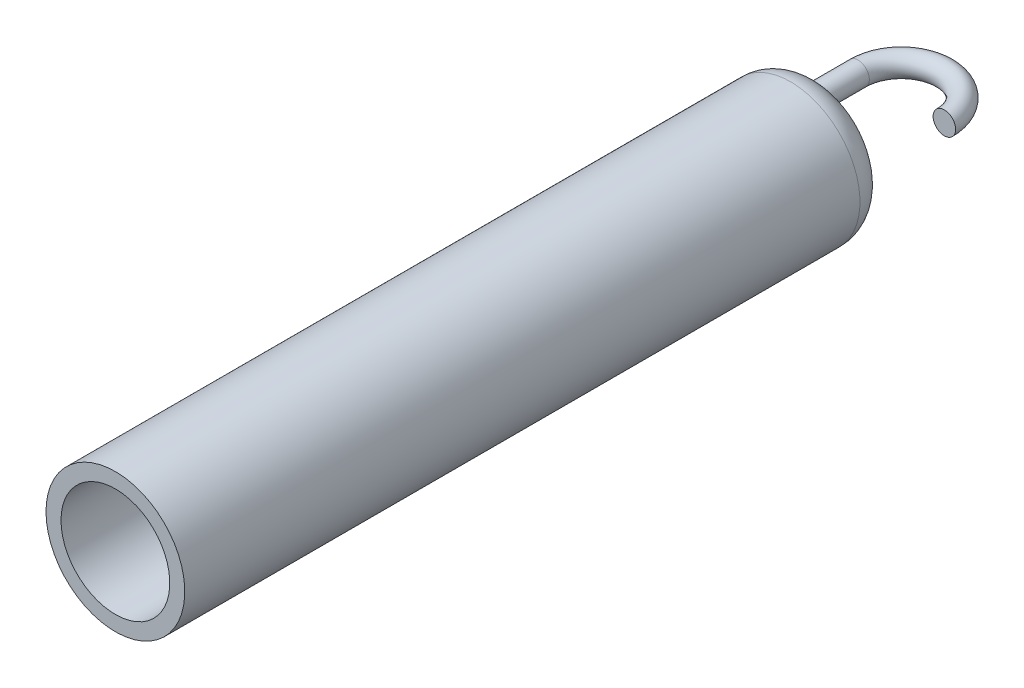
ISO-10303-21;
HEADER;
FILE_DESCRIPTION(('STEP AP214'),'2;1');
FILE_NAME('part.step','',(''),(''),'','','');
FILE_SCHEMA(('AUTOMOTIVE_DESIGN { 1 0 10303 214 1 1 1 1 }'));
ENDSEC;
DATA;
#1=APPLICATION_CONTEXT('core data for automotive mechanical design processes');
#2=APPLICATION_PROTOCOL_DEFINITION('international standard','automotive_design',2000,#1);
#3=PRODUCT_CONTEXT('',#1,'mechanical');
#4=PRODUCT('Part','Part','',(#3));
#5=PRODUCT_RELATED_PRODUCT_CATEGORY('part','',(#4));
#6=PRODUCT_DEFINITION_FORMATION('','',#4);
#7=PRODUCT_DEFINITION_CONTEXT('part definition',#1,'design');
#8=PRODUCT_DEFINITION('design','',#6,#7);
#9=PRODUCT_DEFINITION_SHAPE('','',#8);
#10=(LENGTH_UNIT() NAMED_UNIT(*) SI_UNIT(.MILLI.,.METRE.));
#11=(NAMED_UNIT(*) PLANE_ANGLE_UNIT() SI_UNIT($,.RADIAN.));
#12=(NAMED_UNIT(*) SI_UNIT($,.STERADIAN.) SOLID_ANGLE_UNIT());
#13=UNCERTAINTY_MEASURE_WITH_UNIT(LENGTH_MEASURE(1.E-05),#10,'distance_accuracy_value','');
#14=(GEOMETRIC_REPRESENTATION_CONTEXT(3) GLOBAL_UNCERTAINTY_ASSIGNED_CONTEXT((#13)) GLOBAL_UNIT_ASSIGNED_CONTEXT((#10,
#11,#12)) REPRESENTATION_CONTEXT('',''));
#15=CARTESIAN_POINT('',(0.,0.,0.));
#16=DIRECTION('',(0.,0.,1.));
#17=DIRECTION('',(1.,0.,0.));
#18=AXIS2_PLACEMENT_3D('',#15,#16,#17);
#19=CARTESIAN_POINT('',(0.,0.,-44.9999999999999));
#20=DIRECTION('',(0.,0.,-1.));
#21=DIRECTION('',(-1.,0.,0.));
#22=AXIS2_PLACEMENT_3D('',#19,#20,#21);
#23=TOROIDAL_SURFACE('',#22,5.24999999999994,4.00000000000006);
#24=CARTESIAN_POINT('',(0.,0.,-44.9999999999999));
#25=DIRECTION('',(0.,0.,-1.));
#26=DIRECTION('',(-1.,0.,0.));
#27=AXIS2_PLACEMENT_3D('',#24,#25,#26);
#28=CIRCLE('',#27,9.25);
#29=CARTESIAN_POINT('',(-9.25,0.,-44.9999999999999));
#30=VERTEX_POINT('',#29);
#31=EDGE_CURVE('E63',#30,#30,#28,.T.);
#32=ORIENTED_EDGE('',*,*,#31,.T.);
#33=EDGE_LOOP('',(#32));
#34=FACE_BOUND('',#33,.T.);
#35=CARTESIAN_POINT('',(0.,0.,-49.));
#36=DIRECTION('',(0.,0.,-1.));
#37=DIRECTION('',(-1.,0.,0.));
#38=AXIS2_PLACEMENT_3D('',#35,#36,#37);
#39=CIRCLE('',#38,5.24999999999994);
#40=CARTESIAN_POINT('',(-5.07608695652169,1.3400900006454,-49.));
#41=VERTEX_POINT('',#40);
#42=CARTESIAN_POINT('',(-5.07608695652169,-1.3400900006454,-49.));
#43=VERTEX_POINT('',#42);
#44=EDGE_CURVE('E61',#41,#43,#39,.T.);
#45=ORIENTED_EDGE('',*,*,#44,.F.);
#46=CARTESIAN_POINT('',(-7.00648582720763,-0.819294431829194,-48.5699822132683));
#47=CARTESIAN_POINT('',(-6.95880276354394,-0.89241963811899,-48.5896247700951));
#48=CARTESIAN_POINT('',(-6.90495205526455,-0.961029564039703,-48.6111751680601));
#49=CARTESIAN_POINT('',(-6.78664381902749,-1.0876059666946,-48.6563949104901));
#50=CARTESIAN_POINT('',(-6.722178803184,-1.14556486811943,-48.6800657454082));
#51=CARTESIAN_POINT('',(-6.5844565255144,-1.24944427687394,-48.7278267954799));
#52=CARTESIAN_POINT('',(-6.51121003605053,-1.29537931813734,-48.7519164664298));
#53=CARTESIAN_POINT('',(-6.35763599431734,-1.37412635623365,-48.7989480205856));
#54=CARTESIAN_POINT('',(-6.27730933604538,-1.40694000698701,-48.82189004813));
#55=CARTESIAN_POINT('',(-6.11075746420721,-1.45860321330962,-48.8653086789364));
#56=CARTESIAN_POINT('',(-6.02448466271204,-1.47732112595096,-48.8857605799956));
#57=CARTESIAN_POINT('',(-5.84911659656696,-1.49932499102619,-48.9224922740108));
#58=CARTESIAN_POINT('',(-5.76002240718185,-1.50261675295842,-48.9387736354104));
#59=CARTESIAN_POINT('',(-5.58686734326178,-1.49347777049111,-48.9652049402742));
#60=CARTESIAN_POINT('',(-5.50280560017314,-1.48192209509465,-48.9756485668979));
#61=CARTESIAN_POINT('',(-5.33738797020383,-1.44462117010289,-48.9911322484317));
#62=CARTESIAN_POINT('',(-5.25603084049764,-1.41888253617484,-48.9961748194484));
#63=CARTESIAN_POINT('',(-5.10353815170019,-1.3559045242371,-49.0006693060912));
#64=CARTESIAN_POINT('',(-5.03208185257051,-1.31946028511138,-49.0004427471582));
#65=CARTESIAN_POINT('',(-4.89599422909807,-1.2357413106536,-48.9957005906926));
#66=CARTESIAN_POINT('',(-4.831362947117,-1.1884665081039,-48.9911849665403));
#67=CARTESIAN_POINT('',(-4.71045148341299,-1.08430918240141,-48.9788956140234));
#68=CARTESIAN_POINT('',(-4.65419430619093,-1.02740107876556,-48.9711131271348));
#69=CARTESIAN_POINT('',(-4.5515127497806,-0.905529310858771,-48.9537934234672));
#70=CARTESIAN_POINT('',(-4.50509274037591,-0.840562086863528,-48.9442554303725));
#71=CARTESIAN_POINT('',(-4.42095130481305,-0.70046623711611,-48.9247285433275));
#72=CARTESIAN_POINT('',(-4.38381970514963,-0.624981933913588,-48.9147424784738));
#73=CARTESIAN_POINT('',(-4.32261954007652,-0.468644287017166,-48.8970357515464));
#74=CARTESIAN_POINT('',(-4.29854767844395,-0.387792303890754,-48.8893145180649));
#75=CARTESIAN_POINT('',(-4.26428925533951,-0.223004838363475,-48.8780028280472));
#76=CARTESIAN_POINT('',(-4.25408386171937,-0.139073697311763,-48.8744067701172));
#77=CARTESIAN_POINT('',(-4.24792302195601,0.0293591736732388,-48.8722603631427));
#78=CARTESIAN_POINT('',(-4.2519631525244,0.113860718361565,-48.8737084478712));
#79=CARTESIAN_POINT('',(-4.27354825757059,0.276568191186246,-48.8810706777133));
#80=CARTESIAN_POINT('',(-4.2904066769259,0.354877457814284,-48.8867574976105));
#81=CARTESIAN_POINT('',(-4.33624370790428,0.50759688525563,-48.9010435934114));
#82=CARTESIAN_POINT('',(-4.36522737904318,0.58200540379775,-48.9096440848204));
#83=CARTESIAN_POINT('',(-4.4357317619785,0.727645680276282,-48.9282877684499));
#84=CARTESIAN_POINT('',(-4.47764937109523,0.798680167553703,-48.938370405743));
#85=CARTESIAN_POINT('',(-4.57261209771403,0.9330187464743,-48.9576634550197));
#86=CARTESIAN_POINT('',(-4.62565777874425,0.996322446371653,-48.9668738227969));
#87=CARTESIAN_POINT('',(-4.74336325147982,1.11529644327687,-48.9827959987862));
#88=CARTESIAN_POINT('',(-4.80832104227681,1.17068438911552,-48.9894255289928));
#89=CARTESIAN_POINT('',(-4.94688923901598,1.26974771242417,-48.9982348480398));
#90=CARTESIAN_POINT('',(-5.02049641058066,1.31342744817873,-49.000416294646));
#91=CARTESIAN_POINT('',(-5.17038147945679,1.38587162152664,-48.9994727829872));
#92=CARTESIAN_POINT('',(-5.24636670109369,1.41524569365243,-48.9965948198497));
#93=CARTESIAN_POINT('',(-5.40175300013476,1.46126259884585,-48.9858421030453));
#94=CARTESIAN_POINT('',(-5.48115382189077,1.47790638299492,-48.9779677227418));
#95=CARTESIAN_POINT('',(-5.63918322973002,1.49797317890163,-48.957811772954));
#96=CARTESIAN_POINT('',(-5.71778886113814,1.50168582491517,-48.9456335779824));
#97=CARTESIAN_POINT('',(-5.87394183749304,1.49691142715464,-48.9175337391294));
#98=CARTESIAN_POINT('',(-5.95148899954726,1.48842230131811,-48.9016114567595));
#99=CARTESIAN_POINT('',(-6.10719710869636,1.45909909412225,-48.8661287325446));
#100=CARTESIAN_POINT('',(-6.18522450734554,1.4377192180346,-48.8464354011926));
#101=CARTESIAN_POINT('',(-6.33640377085763,1.38296787287246,-48.8050948133783));
#102=CARTESIAN_POINT('',(-6.40955392722006,1.34959222756651,-48.7834468784042));
#103=CARTESIAN_POINT('',(-6.5541227989901,1.26912478063694,-48.7379570918976));
#104=CARTESIAN_POINT('',(-6.6251000216024,1.22126613767108,-48.7140652498));
#105=CARTESIAN_POINT('',(-6.75807165028333,1.11404207662126,-48.6670145971367));
#106=CARTESIAN_POINT('',(-6.82006335003475,1.05467320434612,-48.6438560090518));
#107=CARTESIAN_POINT('',(-6.93461412611736,0.924324720502867,-48.5994196806079));
#108=CARTESIAN_POINT('',(-6.98694046083527,0.853121960762416,-48.5781933890605));
#109=CARTESIAN_POINT('',(-7.07864920398065,0.701789509307921,-48.5399662401913));
#110=CARTESIAN_POINT('',(-7.11803726785092,0.621663738491103,-48.5229635374926));
#111=CARTESIAN_POINT('',(-7.18036757850432,0.459519008752517,-48.4956096638021));
#112=CARTESIAN_POINT('',(-7.20411680440399,0.377866025477641,-48.4849355673988));
#113=CARTESIAN_POINT('',(-7.23748658830593,0.211175139604464,-48.4698439483644));
#114=CARTESIAN_POINT('',(-7.24711599085114,0.126139390264639,-48.4654225091813));
#115=CARTESIAN_POINT('',(-7.25158223795804,-0.0375110020045436,-48.4633767679949));
#116=CARTESIAN_POINT('',(-7.24754873555806,-0.116090802379801,-48.4652333726547));
#117=CARTESIAN_POINT('',(-7.22733122929713,-0.271322666102538,-48.4744420141106));
#118=CARTESIAN_POINT('',(-7.21114949543935,-0.34797508683255,-48.4817930242279));
#119=CARTESIAN_POINT('',(-7.1684867048646,-0.493280985551058,-48.5008315726189));
#120=CARTESIAN_POINT('',(-7.14259692324266,-0.562143091311063,-48.5122686444378));
#121=CARTESIAN_POINT('',(-7.0813851527296,-0.69480625262899,-48.5386922862724));
#122=CARTESIAN_POINT('',(-7.04605959422051,-0.758605380955884,-48.5536801993522));
#123=CARTESIAN_POINT('',(-7.00648582720763,-0.819294431829194,-48.5699822132683));
#124=B_SPLINE_CURVE_WITH_KNOTS('',3,(#46,#47,#48,#49,#50,#51,#52,#53,#54,#55,#56,#57,#58,#59,
#60,#61,#62,#63,#64,#65,#66,#67,#68,#69,#70,#71,#72,#73,#74,#75,#76,#77,#78,#79,#80,#81,#82,#83,
#84,#85,#86,#87,#88,#89,#90,#91,#92,#93,#94,#95,#96,#97,#98,#99,#100,#101,#102,#103,#104,#105,
#106,#107,#108,#109,#110,#111,#112,#113,#114,#115,#116,#117,#118,#119,#120,#121,#122,#123),
.UNSPECIFIED.,.T.,.F.,(4,2,2,2,2,2,2,2,2,2,2,2,2,2,2,2,2,2,2,2,2,2,2,2,2,2,2,2,2,2,2,2,2,2,2,2,
2,2,4),(0.,0.268158578395402,0.536507146777401,0.804529833023027,1.0725187249817,
1.34298039732285,1.61334020543339,1.86847301937179,2.12348692675305,2.36298296622263,
2.6024804921148,2.84262425853478,3.08287447701335,3.33582985796499,3.58872136430689,
3.84126907245453,4.09373837050332,4.33356219345329,4.57348618789935,4.8216617754388,
5.06984993368279,5.32540491323163,5.58086463202426,5.82419688833831,6.06751096349197,
6.30533890634551,6.54320743604406,6.79193339334122,7.0407460266076,7.30616677368506,
7.57166729650593,7.84290425505269,8.11402249505392,8.36974275780564,8.6253027709282,
8.86026601875068,9.09518537256239,9.31765485131046,9.54020861125279),.UNSPECIFIED.);
#125=EDGE_CURVE('E54',#41,#43,#124,.T.);
#126=ORIENTED_EDGE('',*,*,#125,.T.);
#127=EDGE_LOOP('',(#45,#126));
#128=FACE_BOUND('',#127,.T.);
#129=ADVANCED_FACE('F39',(#34,#128),#23,.T.);
#130=CARTESIAN_POINT('',(0.,0.,45.));
#131=DIRECTION('',(0.,0.,1.));
#132=DIRECTION('',(1.,0.,0.));
#133=AXIS2_PLACEMENT_3D('',#130,#131,#132);
#134=PLANE('',#133);
#135=CARTESIAN_POINT('',(0.,0.,45.));
#136=DIRECTION('',(0.,0.,1.));
#137=DIRECTION('',(1.,0.,0.));
#138=AXIS2_PLACEMENT_3D('',#135,#136,#137);
#139=CIRCLE('',#138,9.25);
#140=CARTESIAN_POINT('',(-9.25,0.,45.));
#141=VERTEX_POINT('',#140);
#142=EDGE_CURVE('E48',#141,#141,#139,.T.);
#143=ORIENTED_EDGE('',*,*,#142,.T.);
#144=EDGE_LOOP('',(#143));
#145=FACE_BOUND('',#144,.T.);
#146=CARTESIAN_POINT('',(0.,0.,45.));
#147=DIRECTION('',(0.,0.,1.));
#148=DIRECTION('',(1.,0.,0.));
#149=AXIS2_PLACEMENT_3D('',#146,#147,#148);
#150=CIRCLE('',#149,7.25);
#151=CARTESIAN_POINT('',(-7.25,0.,45.));
#152=VERTEX_POINT('',#151);
#153=EDGE_CURVE('E73',#152,#152,#150,.T.);
#154=ORIENTED_EDGE('',*,*,#153,.F.);
#155=EDGE_LOOP('',(#154));
#156=FACE_BOUND('',#155,.T.);
#157=ADVANCED_FACE('F84',(#145,#156),#134,.T.);
#158=CARTESIAN_POINT('',(0.,0.,45.));
#159=DIRECTION('',(0.,0.,-1.));
#160=DIRECTION('',(-1.,0.,0.));
#161=AXIS2_PLACEMENT_3D('',#158,#159,#160);
#162=CYLINDRICAL_SURFACE('',#161,9.25);
#163=CARTESIAN_POINT('',(-9.25,0.,45.));
#164=CARTESIAN_POINT('',(-9.25,0.,44.0625));
#165=CARTESIAN_POINT('',(-9.25,0.,43.125));
#166=CARTESIAN_POINT('',(-9.25,0.,41.25));
#167=CARTESIAN_POINT('',(-9.25,0.,40.3125));
#168=CARTESIAN_POINT('',(-9.25,0.,38.4375));
#169=CARTESIAN_POINT('',(-9.25,0.,37.5));
#170=CARTESIAN_POINT('',(-9.25,0.,35.625));
#171=CARTESIAN_POINT('',(-9.25,0.,34.6875));
#172=CARTESIAN_POINT('',(-9.25,0.,32.8125));
#173=CARTESIAN_POINT('',(-9.25,0.,31.875));
#174=CARTESIAN_POINT('',(-9.25,0.,30.));
#175=CARTESIAN_POINT('',(-9.25,0.,29.0625));
#176=CARTESIAN_POINT('',(-9.25,0.,27.1875));
#177=CARTESIAN_POINT('',(-9.25,0.,26.25));
#178=CARTESIAN_POINT('',(-9.25,0.,24.375));
#179=CARTESIAN_POINT('',(-9.25,0.,23.4375));
#180=CARTESIAN_POINT('',(-9.25,0.,21.5625));
#181=CARTESIAN_POINT('',(-9.25,0.,20.625));
#182=CARTESIAN_POINT('',(-9.25,0.,18.75));
#183=CARTESIAN_POINT('',(-9.25,0.,17.8125));
#184=CARTESIAN_POINT('',(-9.25,0.,15.9375));
#185=CARTESIAN_POINT('',(-9.25,0.,15.));
#186=CARTESIAN_POINT('',(-9.25,0.,13.125));
#187=CARTESIAN_POINT('',(-9.25,0.,12.1875));
#188=CARTESIAN_POINT('',(-9.25,0.,10.3125));
#189=CARTESIAN_POINT('',(-9.25,0.,9.37500000000002));
#190=CARTESIAN_POINT('',(-9.25,0.,7.50000000000002));
#191=CARTESIAN_POINT('',(-9.25,0.,6.56250000000002));
#192=CARTESIAN_POINT('',(-9.25,0.,4.68750000000002));
#193=CARTESIAN_POINT('',(-9.25,0.,3.75000000000002));
#194=CARTESIAN_POINT('',(-9.25,0.,1.87500000000002));
#195=CARTESIAN_POINT('',(-9.25,0.,0.937500000000026));
#196=CARTESIAN_POINT('',(-9.25,0.,-0.937499999999971));
#197=CARTESIAN_POINT('',(-9.25,0.,-1.87499999999997));
#198=CARTESIAN_POINT('',(-9.25,0.,-3.74999999999997));
#199=CARTESIAN_POINT('',(-9.25,0.,-4.68749999999997));
#200=CARTESIAN_POINT('',(-9.25,0.,-6.56249999999997));
#201=CARTESIAN_POINT('',(-9.25,0.,-7.49999999999997));
#202=CARTESIAN_POINT('',(-9.25,0.,-9.37499999999997));
#203=CARTESIAN_POINT('',(-9.25,0.,-10.3125));
#204=CARTESIAN_POINT('',(-9.25,0.,-12.1875));
#205=CARTESIAN_POINT('',(-9.25,0.,-13.125));
#206=CARTESIAN_POINT('',(-9.25,0.,-15.));
#207=CARTESIAN_POINT('',(-9.25,0.,-15.9375));
#208=CARTESIAN_POINT('',(-9.25,0.,-17.8125));
#209=CARTESIAN_POINT('',(-9.25,0.,-18.7499999999999));
#210=CARTESIAN_POINT('',(-9.25,0.,-20.6249999999999));
#211=CARTESIAN_POINT('',(-9.25,0.,-21.5624999999999));
#212=CARTESIAN_POINT('',(-9.25,0.,-23.4374999999999));
#213=CARTESIAN_POINT('',(-9.25,0.,-24.3749999999999));
#214=CARTESIAN_POINT('',(-9.25,0.,-26.2499999999999));
#215=CARTESIAN_POINT('',(-9.25,0.,-27.1874999999999));
#216=CARTESIAN_POINT('',(-9.25,0.,-29.0624999999999));
#217=CARTESIAN_POINT('',(-9.25,0.,-29.9999999999999));
#218=CARTESIAN_POINT('',(-9.25,0.,-31.8749999999999));
#219=CARTESIAN_POINT('',(-9.25,0.,-32.8124999999999));
#220=CARTESIAN_POINT('',(-9.25,0.,-34.6874999999999));
#221=CARTESIAN_POINT('',(-9.25,0.,-35.6249999999999));
#222=CARTESIAN_POINT('',(-9.25,0.,-37.4999999999999));
#223=CARTESIAN_POINT('',(-9.25,0.,-38.4374999999999));
#224=CARTESIAN_POINT('',(-9.25,0.,-40.3124999999999));
#225=CARTESIAN_POINT('',(-9.25,0.,-41.2499999999999));
#226=CARTESIAN_POINT('',(-9.25,0.,-43.1249999999999));
#227=CARTESIAN_POINT('',(-9.25,0.,-44.0624999999999));
#228=CARTESIAN_POINT('',(-9.25,0.,-44.9999999999999));
#229=B_SPLINE_CURVE_WITH_KNOTS('',3,(#163,#164,#165,#166,#167,#168,#169,#170,#171,#172,#173,
#174,#175,#176,#177,#178,#179,#180,#181,#182,#183,#184,#185,#186,#187,#188,#189,#190,#191,#192,
#193,#194,#195,#196,#197,#198,#199,#200,#201,#202,#203,#204,#205,#206,#207,#208,#209,#210,#211,
#212,#213,#214,#215,#216,#217,#218,#219,#220,#221,#222,#223,#224,#225,#226,#227,#228),
.UNSPECIFIED.,.F.,.F.,(4,2,2,2,2,2,2,2,2,2,2,2,2,2,2,2,2,2,2,2,2,2,2,2,2,2,2,2,2,2,2,2,4),(0.,
2.8125,5.62499999999999,8.43749999999999,11.25,14.0625,16.875,19.6875,22.5,25.3125,28.125,
30.9375,33.75,36.5625,39.375,42.1875,45.,47.8125,50.625,53.4375,56.25,59.0625,61.875,
64.6874999999999,67.4999999999999,70.3124999999999,73.1249999999999,75.9374999999999,
78.7499999999999,81.5624999999999,84.3749999999999,87.1874999999999,89.9999999999999),.UNSPECIFIED.);
#230=EDGE_CURVE('BSEAM41',#141,#30,#229,.T.);
#231=ORIENTED_EDGE('',*,*,#142,.F.);
#232=ORIENTED_EDGE('',*,*,#31,.F.);
#233=ORIENTED_EDGE('',*,*,#230,.T.);
#234=ORIENTED_EDGE('',*,*,#230,.F.);
#235=EDGE_LOOP('',(#231,#233,#232,#234));
#236=FACE_BOUND('',#235,.T.);
#237=ADVANCED_FACE('F41',(#236),#162,.T.);
#238=CARTESIAN_POINT('',(0.,0.,45.));
#239=DIRECTION('',(0.,0.,-1.));
#240=DIRECTION('',(-1.,0.,0.));
#241=AXIS2_PLACEMENT_3D('',#238,#239,#240);
#242=CYLINDRICAL_SURFACE('',#241,7.25);
#243=CARTESIAN_POINT('',(0.,0.,-45.));
#244=DIRECTION('',(0.,0.,1.));
#245=DIRECTION('',(1.,0.,0.));
#246=AXIS2_PLACEMENT_3D('',#243,#244,#245);
#247=CIRCLE('',#246,7.25);
#248=CARTESIAN_POINT('',(-7.25,0.,-45.));
#249=VERTEX_POINT('',#248);
#250=EDGE_CURVE('E68',#249,#249,#247,.T.);
#251=CARTESIAN_POINT('',(-7.25,0.,45.));
#252=CARTESIAN_POINT('',(-7.25,0.,44.0625));
#253=CARTESIAN_POINT('',(-7.25,0.,43.125));
#254=CARTESIAN_POINT('',(-7.25,0.,41.25));
#255=CARTESIAN_POINT('',(-7.25,0.,40.3125));
#256=CARTESIAN_POINT('',(-7.25,0.,38.4375));
#257=CARTESIAN_POINT('',(-7.25,0.,37.5));
#258=CARTESIAN_POINT('',(-7.25,0.,35.625));
#259=CARTESIAN_POINT('',(-7.25,0.,34.6875));
#260=CARTESIAN_POINT('',(-7.25,0.,32.8125));
#261=CARTESIAN_POINT('',(-7.25,0.,31.875));
#262=CARTESIAN_POINT('',(-7.25,0.,30.));
#263=CARTESIAN_POINT('',(-7.25,0.,29.0625));
#264=CARTESIAN_POINT('',(-7.25,0.,27.1875));
#265=CARTESIAN_POINT('',(-7.25,0.,26.25));
#266=CARTESIAN_POINT('',(-7.25,0.,24.375));
#267=CARTESIAN_POINT('',(-7.25,0.,23.4375));
#268=CARTESIAN_POINT('',(-7.25,0.,21.5625));
#269=CARTESIAN_POINT('',(-7.25,0.,20.625));
#270=CARTESIAN_POINT('',(-7.25,0.,18.75));
#271=CARTESIAN_POINT('',(-7.25,0.,17.8125));
#272=CARTESIAN_POINT('',(-7.25,0.,15.9375));
#273=CARTESIAN_POINT('',(-7.25,0.,15.));
#274=CARTESIAN_POINT('',(-7.25,0.,13.125));
#275=CARTESIAN_POINT('',(-7.25,0.,12.1875));
#276=CARTESIAN_POINT('',(-7.25,0.,10.3125));
#277=CARTESIAN_POINT('',(-7.25,0.,9.37499999999999));
#278=CARTESIAN_POINT('',(-7.25,0.,7.5));
#279=CARTESIAN_POINT('',(-7.25,0.,6.5625));
#280=CARTESIAN_POINT('',(-7.25,0.,4.6875));
#281=CARTESIAN_POINT('',(-7.25,0.,3.75));
#282=CARTESIAN_POINT('',(-7.25,0.,1.87499999999999));
#283=CARTESIAN_POINT('',(-7.25,0.,0.937499999999994));
#284=CARTESIAN_POINT('',(-7.25,0.,-0.937500000000008));
#285=CARTESIAN_POINT('',(-7.25,0.,-1.87500000000001));
#286=CARTESIAN_POINT('',(-7.25,0.,-3.75000000000001));
#287=CARTESIAN_POINT('',(-7.25,0.,-4.68750000000001));
#288=CARTESIAN_POINT('',(-7.25,0.,-6.56250000000001));
#289=CARTESIAN_POINT('',(-7.25,0.,-7.50000000000001));
#290=CARTESIAN_POINT('',(-7.25,0.,-9.37500000000001));
#291=CARTESIAN_POINT('',(-7.25,0.,-10.3125));
#292=CARTESIAN_POINT('',(-7.25,0.,-12.1875));
#293=CARTESIAN_POINT('',(-7.25,0.,-13.125));
#294=CARTESIAN_POINT('',(-7.25,0.,-15.));
#295=CARTESIAN_POINT('',(-7.25,0.,-15.9375));
#296=CARTESIAN_POINT('',(-7.25,0.,-17.8125));
#297=CARTESIAN_POINT('',(-7.25,0.,-18.75));
#298=CARTESIAN_POINT('',(-7.25,0.,-20.625));
#299=CARTESIAN_POINT('',(-7.25,0.,-21.5625));
#300=CARTESIAN_POINT('',(-7.25,0.,-23.4375));
#301=CARTESIAN_POINT('',(-7.25,0.,-24.375));
#302=CARTESIAN_POINT('',(-7.25,0.,-26.25));
#303=CARTESIAN_POINT('',(-7.25,0.,-27.1875));
#304=CARTESIAN_POINT('',(-7.25,0.,-29.0625));
#305=CARTESIAN_POINT('',(-7.25,0.,-30.));
#306=CARTESIAN_POINT('',(-7.25,0.,-31.875));
#307=CARTESIAN_POINT('',(-7.25,0.,-32.8125));
#308=CARTESIAN_POINT('',(-7.25,0.,-34.6875));
#309=CARTESIAN_POINT('',(-7.25,0.,-35.625));
#310=CARTESIAN_POINT('',(-7.25,0.,-37.5));
#311=CARTESIAN_POINT('',(-7.25,0.,-38.4375));
#312=CARTESIAN_POINT('',(-7.25,0.,-40.3125));
#313=CARTESIAN_POINT('',(-7.25,0.,-41.25));
#314=CARTESIAN_POINT('',(-7.25,0.,-43.125));
#315=CARTESIAN_POINT('',(-7.25,0.,-44.0625));
#316=CARTESIAN_POINT('',(-7.25,0.,-45.));
#317=B_SPLINE_CURVE_WITH_KNOTS('',3,(#251,#252,#253,#254,#255,#256,#257,#258,#259,#260,#261,
#262,#263,#264,#265,#266,#267,#268,#269,#270,#271,#272,#273,#274,#275,#276,#277,#278,#279,#280,
#281,#282,#283,#284,#285,#286,#287,#288,#289,#290,#291,#292,#293,#294,#295,#296,#297,#298,#299,
#300,#301,#302,#303,#304,#305,#306,#307,#308,#309,#310,#311,#312,#313,#314,#315,#316),
.UNSPECIFIED.,.F.,.F.,(4,2,2,2,2,2,2,2,2,2,2,2,2,2,2,2,2,2,2,2,2,2,2,2,2,2,2,2,2,2,2,2,4),(0.,
2.8125,5.62500000000001,8.4375,11.25,14.0625,16.875,19.6875,22.5,25.3125,28.125,30.9375,33.75,
36.5625,39.375,42.1875,45.,47.8125,50.625,53.4375,56.25,59.0625,61.875,64.6875,67.5,70.3125,
73.125,75.9375,78.75,81.5625,84.375,87.1875,90.),.UNSPECIFIED.);
#318=EDGE_CURVE('BSEAM89',#152,#249,#317,.T.);
#319=ORIENTED_EDGE('',*,*,#153,.T.);
#320=ORIENTED_EDGE('',*,*,#250,.F.);
#321=ORIENTED_EDGE('',*,*,#318,.T.);
#322=ORIENTED_EDGE('',*,*,#318,.F.);
#323=EDGE_LOOP('',(#319,#321,#320,#322));
#324=FACE_BOUND('',#323,.T.);
#325=ADVANCED_FACE('F89',(#324),#242,.F.);
#326=CARTESIAN_POINT('',(0.,0.,-45.));
#327=DIRECTION('',(0.,0.,1.));
#328=DIRECTION('',(1.,0.,0.));
#329=AXIS2_PLACEMENT_3D('',#326,#327,#328);
#330=PLANE('',#329);
#331=ORIENTED_EDGE('',*,*,#250,.T.);
#332=EDGE_LOOP('',(#331));
#333=FACE_BOUND('',#332,.T.);
#334=ADVANCED_FACE('F115',(#333),#330,.T.);
#335=CARTESIAN_POINT('',(-5.24999999999994,0.,-49.));
#336=DIRECTION('',(0.,0.,-1.));
#337=DIRECTION('',(-1.,0.,0.));
#338=AXIS2_PLACEMENT_3D('',#335,#336,#337);
#339=PLANE('',#338);
#340=ORIENTED_EDGE('',*,*,#44,.T.);
#341=CARTESIAN_POINT('',(-5.74999999999999,0.,-49.));
#342=DIRECTION('',(0.,0.,-1.));
#343=DIRECTION('',(-1.,0.,0.));
#344=AXIS2_PLACEMENT_3D('',#341,#342,#343);
#345=CIRCLE('',#344,1.5);
#346=EDGE_CURVE('E11',#43,#41,#345,.F.);
#347=ORIENTED_EDGE('',*,*,#346,.T.);
#348=EDGE_LOOP('',(#340,#347));
#349=FACE_BOUND('',#348,.T.);
#350=ADVANCED_FACE('F66',(#349),#339,.T.);
#351=CARTESIAN_POINT('',(5.74999999999999,0.,-59.75));
#352=DIRECTION('',(0.,0.,1.));
#353=DIRECTION('',(1.,0.,0.));
#354=AXIS2_PLACEMENT_3D('',#351,#352,#353);
#355=PLANE('',#354);
#356=CARTESIAN_POINT('',(5.74999999999999,0.,-59.75));
#357=DIRECTION('',(0.,0.,1.));
#358=DIRECTION('',(1.,0.,0.));
#359=AXIS2_PLACEMENT_3D('',#356,#357,#358);
#360=CIRCLE('',#359,1.5);
#361=CARTESIAN_POINT('',(7.24999999999999,0.,-59.75));
#362=VERTEX_POINT('',#361);
#363=EDGE_CURVE('E183',#362,#362,#360,.T.);
#364=ORIENTED_EDGE('',*,*,#363,.T.);
#365=EDGE_LOOP('',(#364));
#366=FACE_BOUND('',#365,.T.);
#367=ADVANCED_FACE('F112',(#366),#355,.T.);
#368=CARTESIAN_POINT('',(0.,0.,-59.75));
#369=DIRECTION('',(0.,1.,0.));
#370=DIRECTION('',(0.,0.,1.));
#371=AXIS2_PLACEMENT_3D('',#368,#369,#370);
#372=TOROIDAL_SURFACE('',#371,5.74999999999999,1.5);
#373=CARTESIAN_POINT('',(-5.74999999999999,0.,-59.75));
#374=DIRECTION('',(0.,0.,-1.));
#375=DIRECTION('',(-1.,0.,0.));
#376=AXIS2_PLACEMENT_3D('',#373,#374,#375);
#377=CIRCLE('',#376,1.5);
#378=CARTESIAN_POINT('',(-7.24999999999999,0.,-59.75));
#379=VERTEX_POINT('',#378);
#380=EDGE_CURVE('E64',#379,#379,#377,.T.);
#381=CARTESIAN_POINT('',(0.,0.,-59.75));
#382=DIRECTION('',(0.,1.,0.));
#383=DIRECTION('',(0.,0.,1.));
#384=AXIS2_PLACEMENT_3D('',#381,#382,#383);
#385=CIRCLE('',#384,7.24999999999999);
#386=EDGE_CURVE('',#362,#379,#385,.T.);
#387=ORIENTED_EDGE('',*,*,#363,.F.);
#388=ORIENTED_EDGE('',*,*,#380,.T.);
#389=ORIENTED_EDGE('',*,*,#386,.T.);
#390=ORIENTED_EDGE('',*,*,#386,.F.);
#391=EDGE_LOOP('',(#387,#389,#388,#390));
#392=FACE_BOUND('',#391,.T.);
#393=ADVANCED_FACE('F111',(#392),#372,.T.);
#394=CARTESIAN_POINT('',(-5.74999999999999,0.,-59.75));
#395=DIRECTION('',(0.,0.,1.));
#396=DIRECTION('',(1.,0.,0.));
#397=AXIS2_PLACEMENT_3D('',#394,#395,#396);
#398=CYLINDRICAL_SURFACE('',#397,1.5);
#399=ORIENTED_EDGE('',*,*,#125,.F.);
#400=ORIENTED_EDGE('',*,*,#346,.F.);
#401=EDGE_LOOP('',(#399,#400));
#402=FACE_BOUND('',#401,.T.);
#403=ORIENTED_EDGE('',*,*,#380,.F.);
#404=EDGE_LOOP('',(#403));
#405=FACE_BOUND('',#404,.T.);
#406=ADVANCED_FACE('F55',(#402,#405),#398,.T.);
#407=CLOSED_SHELL('',(#129,#157,#237,#325,#334,#350,#367,#393,#406));
#408=MANIFOLD_SOLID_BREP('B2',#407);
#409=ADVANCED_BREP_SHAPE_REPRESENTATION('',(#18,#408),#14);
#410=SHAPE_DEFINITION_REPRESENTATION(#9,#409);
ENDSEC;
END-ISO-10303-21;
